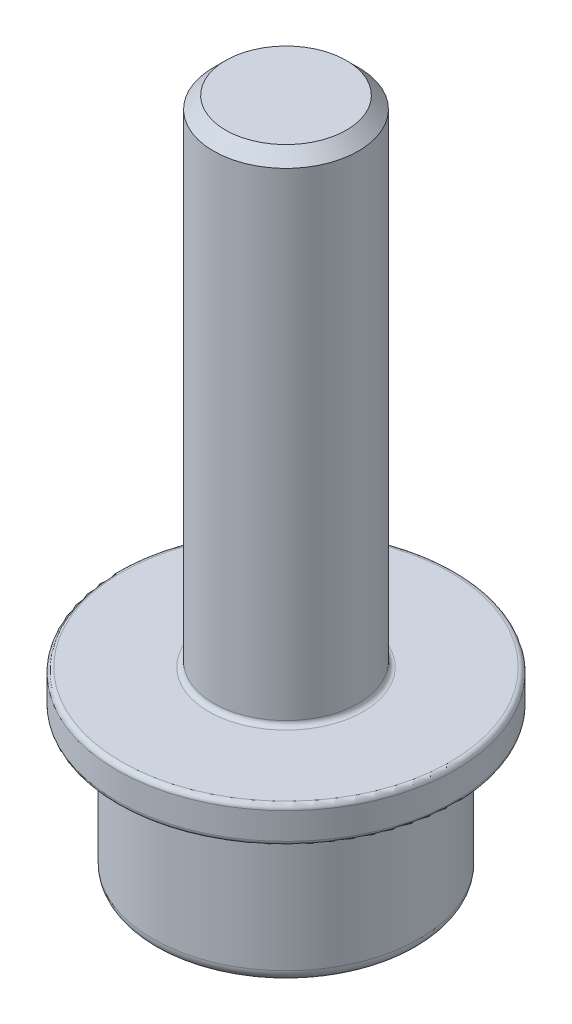
ISO-10303-21;
HEADER;
FILE_DESCRIPTION(('STEP AP214'),'2;1');
FILE_NAME('part.step','',(''),(''),'','','');
FILE_SCHEMA(('AUTOMOTIVE_DESIGN { 1 0 10303 214 1 1 1 1 }'));
ENDSEC;
DATA;
#1=APPLICATION_CONTEXT('core data for automotive mechanical design processes');
#2=APPLICATION_PROTOCOL_DEFINITION('international standard','automotive_design',2000,#1);
#3=PRODUCT_CONTEXT('',#1,'mechanical');
#4=PRODUCT('Part','Part','',(#3));
#5=PRODUCT_RELATED_PRODUCT_CATEGORY('part','',(#4));
#6=PRODUCT_DEFINITION_FORMATION('','',#4);
#7=PRODUCT_DEFINITION_CONTEXT('part definition',#1,'design');
#8=PRODUCT_DEFINITION('design','',#6,#7);
#9=PRODUCT_DEFINITION_SHAPE('','',#8);
#10=(LENGTH_UNIT() NAMED_UNIT(*) SI_UNIT(.MILLI.,.METRE.));
#11=(NAMED_UNIT(*) PLANE_ANGLE_UNIT() SI_UNIT($,.RADIAN.));
#12=(NAMED_UNIT(*) SI_UNIT($,.STERADIAN.) SOLID_ANGLE_UNIT());
#13=UNCERTAINTY_MEASURE_WITH_UNIT(LENGTH_MEASURE(1.E-05),#10,'distance_accuracy_value','');
#14=(GEOMETRIC_REPRESENTATION_CONTEXT(3) GLOBAL_UNCERTAINTY_ASSIGNED_CONTEXT((#13)) GLOBAL_UNIT_ASSIGNED_CONTEXT((#10,
#11,#12)) REPRESENTATION_CONTEXT('',''));
#15=CARTESIAN_POINT('',(0.,0.,0.));
#16=DIRECTION('',(0.,0.,1.));
#17=DIRECTION('',(1.,0.,0.));
#18=AXIS2_PLACEMENT_3D('',#15,#16,#17);
#19=CARTESIAN_POINT('',(0.,3.,0.));
#20=DIRECTION('',(0.,-1.,0.));
#21=DIRECTION('',(0.,0.,-1.));
#22=AXIS2_PLACEMENT_3D('',#19,#20,#21);
#23=CYLINDRICAL_SURFACE('',#22,2.75);
#24=CARTESIAN_POINT('',(0.,2.9,0.));
#25=DIRECTION('',(0.,1.,0.));
#26=DIRECTION('',(0.,0.,1.));
#27=AXIS2_PLACEMENT_3D('',#24,#25,#26);
#28=CIRCLE('',#27,2.75);
#29=CARTESIAN_POINT('',(0.,2.9,2.75));
#30=VERTEX_POINT('',#29);
#31=EDGE_CURVE('E201',#30,#30,#28,.F.);
#32=ORIENTED_EDGE('',*,*,#31,.T.);
#33=EDGE_LOOP('',(#32));
#34=FACE_BOUND('',#33,.T.);
#35=CARTESIAN_POINT('',(0.,0.25,0.));
#36=DIRECTION('',(0.,1.,0.));
#37=DIRECTION('',(0.,0.,1.));
#38=AXIS2_PLACEMENT_3D('',#35,#36,#37);
#39=CIRCLE('',#38,2.75);
#40=CARTESIAN_POINT('',(0.,0.25,2.75));
#41=VERTEX_POINT('',#40);
#42=EDGE_CURVE('E174',#41,#41,#39,.T.);
#43=ORIENTED_EDGE('',*,*,#42,.T.);
#44=EDGE_LOOP('',(#43));
#45=FACE_BOUND('',#44,.T.);
#46=ADVANCED_FACE('F33',(#34,#45),#23,.T.);
#47=CARTESIAN_POINT('',(0.,0.,0.));
#48=DIRECTION('',(0.,1.,0.));
#49=DIRECTION('',(0.,0.,1.));
#50=AXIS2_PLACEMENT_3D('',#47,#48,#49);
#51=PLANE('',#50);
#52=CARTESIAN_POINT('',(0.,0.,0.));
#53=DIRECTION('',(0.,1.,0.));
#54=DIRECTION('',(0.,0.,1.));
#55=AXIS2_PLACEMENT_3D('',#52,#53,#54);
#56=CIRCLE('',#55,2.5);
#57=CARTESIAN_POINT('',(0.,0.,2.5));
#58=VERTEX_POINT('',#57);
#59=EDGE_CURVE('E189',#58,#58,#56,.F.);
#60=ORIENTED_EDGE('',*,*,#59,.T.);
#61=EDGE_LOOP('',(#60));
#62=FACE_BOUND('',#61,.T.);
#63=DIRECTION('',(-0.69197693122312,0.,-0.721919612321922));
#64=VECTOR('',#63,1.);
#65=CARTESIAN_POINT('',(1.02450088015783,0.,-0.982008194523007));
#66=LINE('',#65,#64);
#67=CARTESIAN_POINT('',(1.59146357561211,0.,-0.390512335578875));
#68=VERTEX_POINT('',#67);
#69=CARTESIAN_POINT('',(0.457538184703553,0.,-1.57350405346714));
#70=VERTEX_POINT('',#69);
#71=EDGE_CURVE('E153',#68,#70,#66,.T.);
#72=ORIENTED_EDGE('',*,*,#71,.T.);
#73=DIRECTION('',(-0.971189189372558,0.,0.238309795111058));
#74=VECTOR('',#73,1.);
#75=CARTESIAN_POINT('',(-0.3381936031025,0.,-1.3782478856777));
#76=LINE('',#75,#74);
#77=CARTESIAN_POINT('',(-1.13392539090855,0.,-1.18299171788826));
#78=VERTEX_POINT('',#77);
#79=EDGE_CURVE('E163',#70,#78,#76,.T.);
#80=ORIENTED_EDGE('',*,*,#79,.T.);
#81=DIRECTION('',(-0.279212258149438,0.,0.96022940743298));
#82=VECTOR('',#81,1.);
#83=CARTESIAN_POINT('',(-1.36269448326033,0.,-0.396239691154693));
#84=LINE('',#83,#82);
#85=CARTESIAN_POINT('',(-1.59146357561211,0.,0.390512335578876));
#86=VERTEX_POINT('',#85);
#87=EDGE_CURVE('E161',#78,#86,#84,.T.);
#88=ORIENTED_EDGE('',*,*,#87,.T.);
#89=DIRECTION('',(0.69197693122312,0.,0.721919612321922));
#90=VECTOR('',#89,1.);
#91=CARTESIAN_POINT('',(-1.02450088015783,0.,0.982008194523007));
#92=LINE('',#91,#90);
#93=CARTESIAN_POINT('',(-0.457538184703552,0.,1.57350405346714));
#94=VERTEX_POINT('',#93);
#95=EDGE_CURVE('E159',#86,#94,#92,.T.);
#96=ORIENTED_EDGE('',*,*,#95,.T.);
#97=DIRECTION('',(0.971189189372558,0.,-0.238309795111058));
#98=VECTOR('',#97,1.);
#99=CARTESIAN_POINT('',(0.3381936031025,0.,1.3782478856777));
#100=LINE('',#99,#98);
#101=CARTESIAN_POINT('',(1.13392539090855,0.,1.18299171788826));
#102=VERTEX_POINT('',#101);
#103=EDGE_CURVE('E157',#94,#102,#100,.T.);
#104=ORIENTED_EDGE('',*,*,#103,.T.);
#105=DIRECTION('',(0.279212258149438,0.,-0.96022940743298));
#106=VECTOR('',#105,1.);
#107=CARTESIAN_POINT('',(1.36269448326033,0.,0.396239691154694));
#108=LINE('',#107,#106);
#109=EDGE_CURVE('E155',#102,#68,#108,.T.);
#110=ORIENTED_EDGE('',*,*,#109,.T.);
#111=EDGE_LOOP('',(#72,#80,#88,#96,#104,#110));
#112=FACE_BOUND('',#111,.T.);
#113=ADVANCED_FACE('F243',(#62,#112),#51,.F.);
#114=CARTESIAN_POINT('',(1.31110540565295,1.5,-0.321718223399928));
#115=DIRECTION('',(0.96022940743298,0.,0.279212258149438));
#116=DIRECTION('',(0.279212258149438,0.,-0.96022940743298));
#117=AXIS2_PLACEMENT_3D('',#114,#115,#116);
#118=PLANE('',#117);
#119=DIRECTION('',(0.,-1.,0.));
#120=VECTOR('',#119,1.);
#121=CARTESIAN_POINT('',(1.31110540565295,1.5,-0.321718223399928));
#122=LINE('',#121,#120);
#123=CARTESIAN_POINT('',(1.31110540565295,1.5,-0.321718223399928));
#124=VERTEX_POINT('',#123);
#125=CARTESIAN_POINT('',(1.31110540565295,0.25,-0.321718223399928));
#126=VERTEX_POINT('',#125);
#127=EDGE_CURVE('E139',#124,#126,#122,.T.);
#128=ORIENTED_EDGE('',*,*,#127,.T.);
#129=DIRECTION('',(-0.279212258149438,0.,0.96022940743298));
#130=VECTOR('',#129,1.);
#131=CARTESIAN_POINT('',(1.31110540565295,0.25,-0.321718223399928));
#132=LINE('',#131,#130);
#133=CARTESIAN_POINT('',(0.934168857151212,0.25,0.974591476634595));
#134=VERTEX_POINT('',#133);
#135=EDGE_CURVE('E55',#126,#134,#132,.T.);
#136=ORIENTED_EDGE('',*,*,#135,.T.);
#137=DIRECTION('',(0.,-1.,0.));
#138=VECTOR('',#137,1.);
#139=CARTESIAN_POINT('',(0.934168857151212,1.5,0.974591476634595));
#140=LINE('',#139,#138);
#141=CARTESIAN_POINT('',(0.934168857151212,1.5,0.974591476634595));
#142=VERTEX_POINT('',#141);
#143=EDGE_CURVE('E103',#142,#134,#140,.T.);
#144=ORIENTED_EDGE('',*,*,#143,.F.);
#145=DIRECTION('',(-0.279212258149438,0.,0.96022940743298));
#146=VECTOR('',#145,1.);
#147=CARTESIAN_POINT('',(1.31110540565295,1.5,-0.321718223399928));
#148=LINE('',#147,#146);
#149=EDGE_CURVE('E107',#124,#142,#148,.T.);
#150=ORIENTED_EDGE('',*,*,#149,.F.);
#151=EDGE_LOOP('',(#128,#136,#144,#150));
#152=FACE_BOUND('',#151,.T.);
#153=ADVANCED_FACE('F105',(#152),#118,.F.);
#154=CARTESIAN_POINT('',(0.376936548501741,1.5,-1.29630970003452));
#155=DIRECTION('',(0.721919612321922,0.,-0.69197693122312));
#156=DIRECTION('',(-0.69197693122312,0.,-0.721919612321922));
#157=AXIS2_PLACEMENT_3D('',#154,#155,#156);
#158=PLANE('',#157);
#159=DIRECTION('',(0.,-1.,0.));
#160=VECTOR('',#159,1.);
#161=CARTESIAN_POINT('',(0.376936548501741,1.5,-1.29630970003452));
#162=LINE('',#161,#160);
#163=CARTESIAN_POINT('',(0.376936548501741,1.5,-1.29630970003452));
#164=VERTEX_POINT('',#163);
#165=CARTESIAN_POINT('',(0.376936548501741,0.25,-1.29630970003452));
#166=VERTEX_POINT('',#165);
#167=EDGE_CURVE('E142',#164,#166,#162,.T.);
#168=ORIENTED_EDGE('',*,*,#167,.T.);
#169=DIRECTION('',(0.69197693122312,0.,0.721919612321922));
#170=VECTOR('',#169,1.);
#171=CARTESIAN_POINT('',(0.376936548501741,0.25,-1.29630970003452));
#172=LINE('',#171,#170);
#173=EDGE_CURVE('E48',#166,#126,#172,.T.);
#174=ORIENTED_EDGE('',*,*,#173,.T.);
#175=ORIENTED_EDGE('',*,*,#127,.F.);
#176=DIRECTION('',(0.69197693122312,0.,0.721919612321922));
#177=VECTOR('',#176,1.);
#178=CARTESIAN_POINT('',(0.376936548501741,1.5,-1.29630970003452));
#179=LINE('',#178,#177);
#180=EDGE_CURVE('E112',#164,#124,#179,.T.);
#181=ORIENTED_EDGE('',*,*,#180,.F.);
#182=EDGE_LOOP('',(#168,#174,#175,#181));
#183=FACE_BOUND('',#182,.T.);
#184=ADVANCED_FACE('F310',(#183),#158,.F.);
#185=CARTESIAN_POINT('',(-0.934168857151211,1.5,-0.974591476634595));
#186=DIRECTION('',(-0.238309795111058,0.,-0.971189189372557));
#187=DIRECTION('',(-0.971189189372558,0.,0.238309795111058));
#188=AXIS2_PLACEMENT_3D('',#185,#186,#187);
#189=PLANE('',#188);
#190=DIRECTION('',(0.,-1.,0.));
#191=VECTOR('',#190,1.);
#192=CARTESIAN_POINT('',(-0.934168857151211,1.5,-0.974591476634595));
#193=LINE('',#192,#191);
#194=CARTESIAN_POINT('',(-0.934168857151211,1.5,-0.974591476634595));
#195=VERTEX_POINT('',#194);
#196=CARTESIAN_POINT('',(-0.934168857151211,0.25,-0.974591476634595));
#197=VERTEX_POINT('',#196);
#198=EDGE_CURVE('E144',#195,#197,#193,.T.);
#199=ORIENTED_EDGE('',*,*,#198,.T.);
#200=DIRECTION('',(0.971189189372558,0.,-0.238309795111058));
#201=VECTOR('',#200,1.);
#202=CARTESIAN_POINT('',(-0.934168857151211,0.25,-0.974591476634595));
#203=LINE('',#202,#201);
#204=EDGE_CURVE('E141',#197,#166,#203,.T.);
#205=ORIENTED_EDGE('',*,*,#204,.T.);
#206=ORIENTED_EDGE('',*,*,#167,.F.);
#207=DIRECTION('',(0.971189189372558,0.,-0.238309795111058));
#208=VECTOR('',#207,1.);
#209=CARTESIAN_POINT('',(-0.934168857151211,1.5,-0.974591476634595));
#210=LINE('',#209,#208);
#211=EDGE_CURVE('E136',#195,#164,#210,.T.);
#212=ORIENTED_EDGE('',*,*,#211,.F.);
#213=EDGE_LOOP('',(#199,#205,#206,#212));
#214=FACE_BOUND('',#213,.T.);
#215=ADVANCED_FACE('F320',(#214),#189,.F.);
#216=CARTESIAN_POINT('',(-1.31110540565295,1.5,0.321718223399928));
#217=DIRECTION('',(-0.96022940743298,0.,-0.279212258149438));
#218=DIRECTION('',(-0.279212258149438,0.,0.96022940743298));
#219=AXIS2_PLACEMENT_3D('',#216,#217,#218);
#220=PLANE('',#219);
#221=DIRECTION('',(0.,-1.,0.));
#222=VECTOR('',#221,1.);
#223=CARTESIAN_POINT('',(-1.31110540565295,1.5,0.321718223399928));
#224=LINE('',#223,#222);
#225=CARTESIAN_POINT('',(-1.31110540565295,1.5,0.321718223399928));
#226=VERTEX_POINT('',#225);
#227=CARTESIAN_POINT('',(-1.31110540565295,0.25,0.321718223399928));
#228=VERTEX_POINT('',#227);
#229=EDGE_CURVE('E147',#226,#228,#224,.T.);
#230=ORIENTED_EDGE('',*,*,#229,.T.);
#231=DIRECTION('',(0.279212258149438,0.,-0.96022940743298));
#232=VECTOR('',#231,1.);
#233=CARTESIAN_POINT('',(-1.31110540565295,0.25,0.321718223399928));
#234=LINE('',#233,#232);
#235=EDGE_CURVE('E166',#228,#197,#234,.T.);
#236=ORIENTED_EDGE('',*,*,#235,.T.);
#237=ORIENTED_EDGE('',*,*,#198,.F.);
#238=DIRECTION('',(0.279212258149438,0.,-0.96022940743298));
#239=VECTOR('',#238,1.);
#240=CARTESIAN_POINT('',(-1.31110540565295,1.5,0.321718223399928));
#241=LINE('',#240,#239);
#242=EDGE_CURVE('E133',#226,#195,#241,.T.);
#243=ORIENTED_EDGE('',*,*,#242,.F.);
#244=EDGE_LOOP('',(#230,#236,#237,#243));
#245=FACE_BOUND('',#244,.T.);
#246=ADVANCED_FACE('F316',(#245),#220,.F.);
#247=CARTESIAN_POINT('',(-0.376936548501741,1.5,1.29630970003452));
#248=DIRECTION('',(-0.721919612321922,0.,0.69197693122312));
#249=DIRECTION('',(0.69197693122312,0.,0.721919612321922));
#250=AXIS2_PLACEMENT_3D('',#247,#248,#249);
#251=PLANE('',#250);
#252=DIRECTION('',(0.,-1.,0.));
#253=VECTOR('',#252,1.);
#254=CARTESIAN_POINT('',(-0.376936548501741,1.5,1.29630970003452));
#255=LINE('',#254,#253);
#256=CARTESIAN_POINT('',(-0.376936548501741,1.5,1.29630970003452));
#257=VERTEX_POINT('',#256);
#258=CARTESIAN_POINT('',(-0.376936548501741,0.25,1.29630970003452));
#259=VERTEX_POINT('',#258);
#260=EDGE_CURVE('E111',#257,#259,#255,.T.);
#261=ORIENTED_EDGE('',*,*,#260,.T.);
#262=DIRECTION('',(-0.69197693122312,0.,-0.721919612321922));
#263=VECTOR('',#262,1.);
#264=CARTESIAN_POINT('',(-0.376936548501741,0.25,1.29630970003452));
#265=LINE('',#264,#263);
#266=EDGE_CURVE('E168',#259,#228,#265,.T.);
#267=ORIENTED_EDGE('',*,*,#266,.T.);
#268=ORIENTED_EDGE('',*,*,#229,.F.);
#269=DIRECTION('',(-0.69197693122312,0.,-0.721919612321922));
#270=VECTOR('',#269,1.);
#271=CARTESIAN_POINT('',(-0.376936548501741,1.5,1.29630970003452));
#272=LINE('',#271,#270);
#273=EDGE_CURVE('E121',#257,#226,#272,.T.);
#274=ORIENTED_EDGE('',*,*,#273,.F.);
#275=EDGE_LOOP('',(#261,#267,#268,#274));
#276=FACE_BOUND('',#275,.T.);
#277=ADVANCED_FACE('F313',(#276),#251,.F.);
#278=CARTESIAN_POINT('',(0.934168857151212,1.5,0.974591476634595));
#279=DIRECTION('',(0.238309795111058,0.,0.971189189372558));
#280=DIRECTION('',(0.971189189372558,0.,-0.238309795111058));
#281=AXIS2_PLACEMENT_3D('',#278,#279,#280);
#282=PLANE('',#281);
#283=ORIENTED_EDGE('',*,*,#143,.T.);
#284=DIRECTION('',(-0.971189189372558,0.,0.238309795111058));
#285=VECTOR('',#284,1.);
#286=CARTESIAN_POINT('',(0.934168857151212,0.25,0.974591476634595));
#287=LINE('',#286,#285);
#288=EDGE_CURVE('E170',#134,#259,#287,.T.);
#289=ORIENTED_EDGE('',*,*,#288,.T.);
#290=ORIENTED_EDGE('',*,*,#260,.F.);
#291=DIRECTION('',(-0.971189189372557,0.,0.238309795111058));
#292=VECTOR('',#291,1.);
#293=CARTESIAN_POINT('',(0.934168857151212,1.5,0.974591476634595));
#294=LINE('',#293,#292);
#295=EDGE_CURVE('E115',#142,#257,#294,.T.);
#296=ORIENTED_EDGE('',*,*,#295,.F.);
#297=EDGE_LOOP('',(#283,#289,#290,#296));
#298=FACE_BOUND('',#297,.T.);
#299=ADVANCED_FACE('F116',(#298),#282,.F.);
#300=CARTESIAN_POINT('',(0.,1.5,0.));
#301=DIRECTION('',(0.,-1.,0.));
#302=DIRECTION('',(0.,0.,-1.));
#303=AXIS2_PLACEMENT_3D('',#300,#301,#302);
#304=PLANE('',#303);
#305=ORIENTED_EDGE('',*,*,#149,.T.);
#306=ORIENTED_EDGE('',*,*,#295,.T.);
#307=ORIENTED_EDGE('',*,*,#273,.T.);
#308=ORIENTED_EDGE('',*,*,#242,.T.);
#309=ORIENTED_EDGE('',*,*,#211,.T.);
#310=ORIENTED_EDGE('',*,*,#180,.T.);
#311=EDGE_LOOP('',(#305,#306,#307,#308,#309,#310));
#312=FACE_BOUND('',#311,.T.);
#313=ADVANCED_FACE('F123',(#312),#304,.T.);
#314=CARTESIAN_POINT('',(0.934168857151212,0.25,0.974591476634595));
#315=DIRECTION('',(0.168510472146205,0.70710678118655,0.686734461620399));
#316=DIRECTION('',(-0.971189189372558,0.,0.238309795111058));
#317=AXIS2_PLACEMENT_3D('',#314,#315,#316);
#318=PLANE('',#317);
#319=DIRECTION('',(-0.52308539228858,0.654653670707974,-0.545719931652563));
#320=VECTOR('',#319,1.);
#321=CARTESIAN_POINT('',(0.934168857151212,0.25,0.974591476634595));
#322=LINE('',#321,#320);
#323=EDGE_CURVE('E129',#102,#134,#322,.T.);
#324=ORIENTED_EDGE('',*,*,#323,.F.);
#325=ORIENTED_EDGE('',*,*,#103,.F.);
#326=DIRECTION('',(0.211064628018338,0.654653670707974,-0.72586520389674));
#327=VECTOR('',#326,1.);
#328=CARTESIAN_POINT('',(-0.376936548501741,0.25,1.29630970003452));
#329=LINE('',#328,#327);
#330=EDGE_CURVE('E126',#259,#94,#329,.F.);
#331=ORIENTED_EDGE('',*,*,#330,.F.);
#332=ORIENTED_EDGE('',*,*,#288,.F.);
#333=EDGE_LOOP('',(#324,#325,#331,#332));
#334=FACE_BOUND('',#333,.T.);
#335=ADVANCED_FACE('F273',(#334),#318,.F.);
#336=CARTESIAN_POINT('',(-0.376936548501741,0.25,1.29630970003452));
#337=DIRECTION('',(-0.510474253344393,0.70710678118655,0.489301580492523));
#338=DIRECTION('',(-0.69197693122312,0.,-0.721919612321922));
#339=AXIS2_PLACEMENT_3D('',#336,#337,#338);
#340=PLANE('',#339);
#341=ORIENTED_EDGE('',*,*,#330,.T.);
#342=ORIENTED_EDGE('',*,*,#95,.F.);
#343=DIRECTION('',(0.734150020306917,0.654653670707974,-0.180145272244176));
#344=VECTOR('',#343,1.);
#345=CARTESIAN_POINT('',(-1.31110540565295,0.25,0.321718223399928));
#346=LINE('',#345,#344);
#347=EDGE_CURVE('E182',#228,#86,#346,.F.);
#348=ORIENTED_EDGE('',*,*,#347,.F.);
#349=ORIENTED_EDGE('',*,*,#266,.F.);
#350=EDGE_LOOP('',(#341,#342,#348,#349));
#351=FACE_BOUND('',#350,.T.);
#352=ADVANCED_FACE('F269',(#351),#340,.F.);
#353=CARTESIAN_POINT('',(1.31110540565295,0.25,-0.321718223399928));
#354=DIRECTION('',(0.678984725490597,0.707106781186551,0.197432881127876));
#355=DIRECTION('',(-0.279212258149438,0.,0.96022940743298));
#356=AXIS2_PLACEMENT_3D('',#353,#354,#355);
#357=PLANE('',#356);
#358=ORIENTED_EDGE('',*,*,#323,.T.);
#359=ORIENTED_EDGE('',*,*,#135,.F.);
#360=DIRECTION('',(-0.734150020306917,0.654653670707974,0.180145272244176));
#361=VECTOR('',#360,1.);
#362=CARTESIAN_POINT('',(1.31110540565295,0.25,-0.321718223399928));
#363=LINE('',#362,#361);
#364=EDGE_CURVE('E179',#68,#126,#363,.T.);
#365=ORIENTED_EDGE('',*,*,#364,.F.);
#366=ORIENTED_EDGE('',*,*,#109,.F.);
#367=EDGE_LOOP('',(#358,#359,#365,#366));
#368=FACE_BOUND('',#367,.T.);
#369=ADVANCED_FACE('F265',(#368),#357,.F.);
#370=CARTESIAN_POINT('',(-1.31110540565295,0.25,0.321718223399928));
#371=DIRECTION('',(-0.678984725490598,0.70710678118655,-0.197432881127876));
#372=DIRECTION('',(0.279212258149438,0.,-0.96022940743298));
#373=AXIS2_PLACEMENT_3D('',#370,#371,#372);
#374=PLANE('',#373);
#375=ORIENTED_EDGE('',*,*,#347,.T.);
#376=ORIENTED_EDGE('',*,*,#87,.F.);
#377=DIRECTION('',(0.523085392288579,0.654653670707974,0.545719931652563));
#378=VECTOR('',#377,1.);
#379=CARTESIAN_POINT('',(-0.934168857151211,0.25,-0.974591476634595));
#380=LINE('',#379,#378);
#381=EDGE_CURVE('E177',#197,#78,#380,.F.);
#382=ORIENTED_EDGE('',*,*,#381,.F.);
#383=ORIENTED_EDGE('',*,*,#235,.F.);
#384=EDGE_LOOP('',(#375,#376,#382,#383));
#385=FACE_BOUND('',#384,.T.);
#386=ADVANCED_FACE('F261',(#385),#374,.F.);
#387=CARTESIAN_POINT('',(0.376936548501741,0.25,-1.29630970003452));
#388=DIRECTION('',(0.510474253344392,0.70710678118655,-0.489301580492523));
#389=DIRECTION('',(0.69197693122312,0.,0.721919612321922));
#390=AXIS2_PLACEMENT_3D('',#387,#388,#389);
#391=PLANE('',#390);
#392=ORIENTED_EDGE('',*,*,#364,.T.);
#393=ORIENTED_EDGE('',*,*,#173,.F.);
#394=DIRECTION('',(0.211064628018338,-0.654653670707974,-0.72586520389674));
#395=VECTOR('',#394,1.);
#396=CARTESIAN_POINT('',(0.269240391786957,0.584038370031141,-0.925935500024657));
#397=LINE('',#396,#395);
#398=EDGE_CURVE('E175',#70,#166,#397,.F.);
#399=ORIENTED_EDGE('',*,*,#398,.F.);
#400=ORIENTED_EDGE('',*,*,#71,.F.);
#401=EDGE_LOOP('',(#392,#393,#399,#400));
#402=FACE_BOUND('',#401,.T.);
#403=ADVANCED_FACE('F257',(#402),#391,.F.);
#404=CARTESIAN_POINT('',(-0.934168857151211,0.25,-0.974591476634595));
#405=DIRECTION('',(-0.168510472146205,0.70710678118655,-0.686734461620399));
#406=DIRECTION('',(0.971189189372558,0.,-0.238309795111058));
#407=AXIS2_PLACEMENT_3D('',#404,#405,#406);
#408=PLANE('',#407);
#409=ORIENTED_EDGE('',*,*,#381,.T.);
#410=ORIENTED_EDGE('',*,*,#79,.F.);
#411=ORIENTED_EDGE('',*,*,#398,.T.);
#412=ORIENTED_EDGE('',*,*,#204,.F.);
#413=EDGE_LOOP('',(#409,#410,#411,#412));
#414=FACE_BOUND('',#413,.T.);
#415=ADVANCED_FACE('F254',(#414),#408,.F.);
#416=CARTESIAN_POINT('',(0.,0.25,0.));
#417=DIRECTION('',(0.,1.,0.));
#418=DIRECTION('',(0.,0.,1.));
#419=AXIS2_PLACEMENT_3D('',#416,#417,#418);
#420=TOROIDAL_SURFACE('',#419,2.5,0.25);
#421=ORIENTED_EDGE('',*,*,#59,.F.);
#422=EDGE_LOOP('',(#421));
#423=FACE_BOUND('',#422,.T.);
#424=ORIENTED_EDGE('',*,*,#42,.F.);
#425=EDGE_LOOP('',(#424));
#426=FACE_BOUND('',#425,.T.);
#427=ADVANCED_FACE('F239',(#423,#426),#420,.T.);
#428=CARTESIAN_POINT('',(0.,2.9,0.));
#429=DIRECTION('',(0.,1.,0.));
#430=DIRECTION('',(0.,0.,1.));
#431=AXIS2_PLACEMENT_3D('',#428,#429,#430);
#432=TOROIDAL_SURFACE('',#431,2.65,0.1);
#433=ORIENTED_EDGE('',*,*,#31,.F.);
#434=EDGE_LOOP('',(#433));
#435=FACE_BOUND('',#434,.T.);
#436=CARTESIAN_POINT('',(0.,3.,0.));
#437=DIRECTION('',(0.,1.,0.));
#438=DIRECTION('',(0.,0.,1.));
#439=AXIS2_PLACEMENT_3D('',#436,#437,#438);
#440=CIRCLE('',#439,2.65);
#441=CARTESIAN_POINT('',(0.,3.,2.65));
#442=VERTEX_POINT('',#441);
#443=EDGE_CURVE('E198',#442,#442,#440,.T.);
#444=ORIENTED_EDGE('',*,*,#443,.F.);
#445=EDGE_LOOP('',(#444));
#446=FACE_BOUND('',#445,.T.);
#447=ADVANCED_FACE('F230',(#435,#446),#432,.T.);
#448=CARTESIAN_POINT('',(0.,3.75,0.));
#449=DIRECTION('',(0.,1.,0.));
#450=DIRECTION('',(0.,0.,1.));
#451=AXIS2_PLACEMENT_3D('',#448,#449,#450);
#452=PLANE('',#451);
#453=CARTESIAN_POINT('',(0.,3.75,0.));
#454=DIRECTION('',(0.,1.,0.));
#455=DIRECTION('',(0.,0.,1.));
#456=AXIS2_PLACEMENT_3D('',#453,#454,#455);
#457=CIRCLE('',#456,1.6);
#458=CARTESIAN_POINT('',(0.,3.75,1.6));
#459=VERTEX_POINT('',#458);
#460=EDGE_CURVE('E210',#459,#459,#457,.F.);
#461=ORIENTED_EDGE('',*,*,#460,.T.);
#462=EDGE_LOOP('',(#461));
#463=FACE_BOUND('',#462,.T.);
#464=CARTESIAN_POINT('',(0.,3.75,0.));
#465=DIRECTION('',(0.,1.,0.));
#466=DIRECTION('',(0.,0.,1.));
#467=AXIS2_PLACEMENT_3D('',#464,#465,#466);
#468=CIRCLE('',#467,3.4);
#469=CARTESIAN_POINT('',(0.,3.75,3.4));
#470=VERTEX_POINT('',#469);
#471=EDGE_CURVE('E207',#470,#470,#468,.T.);
#472=ORIENTED_EDGE('',*,*,#471,.T.);
#473=EDGE_LOOP('',(#472));
#474=FACE_BOUND('',#473,.T.);
#475=ADVANCED_FACE('F227',(#463,#474),#452,.T.);
#476=CARTESIAN_POINT('',(0.,3.,0.));
#477=DIRECTION('',(0.,1.,0.));
#478=DIRECTION('',(0.,0.,1.));
#479=AXIS2_PLACEMENT_3D('',#476,#477,#478);
#480=PLANE('',#479);
#481=CARTESIAN_POINT('',(0.,3.,0.));
#482=DIRECTION('',(0.,1.,0.));
#483=DIRECTION('',(0.,0.,1.));
#484=AXIS2_PLACEMENT_3D('',#481,#482,#483);
#485=CIRCLE('',#484,3.4);
#486=CARTESIAN_POINT('',(0.,3.,3.4));
#487=VERTEX_POINT('',#486);
#488=EDGE_CURVE('E11',#487,#487,#485,.F.);
#489=ORIENTED_EDGE('',*,*,#488,.T.);
#490=EDGE_LOOP('',(#489));
#491=FACE_BOUND('',#490,.T.);
#492=ORIENTED_EDGE('',*,*,#443,.T.);
#493=EDGE_LOOP('',(#492));
#494=FACE_BOUND('',#493,.T.);
#495=ADVANCED_FACE('F229',(#491,#494),#480,.F.);
#496=CARTESIAN_POINT('',(0.,3.75,0.));
#497=DIRECTION('',(0.,-1.,0.));
#498=DIRECTION('',(0.,0.,-1.));
#499=AXIS2_PLACEMENT_3D('',#496,#497,#498);
#500=CYLINDRICAL_SURFACE('',#499,3.5);
#501=CARTESIAN_POINT('',(0.,3.65,0.));
#502=DIRECTION('',(0.,1.,0.));
#503=DIRECTION('',(0.,0.,1.));
#504=AXIS2_PLACEMENT_3D('',#501,#502,#503);
#505=CIRCLE('',#504,3.5);
#506=CARTESIAN_POINT('',(0.,3.65,3.5));
#507=VERTEX_POINT('',#506);
#508=EDGE_CURVE('E41',#507,#507,#505,.F.);
#509=ORIENTED_EDGE('',*,*,#508,.T.);
#510=EDGE_LOOP('',(#509));
#511=FACE_BOUND('',#510,.T.);
#512=CARTESIAN_POINT('',(0.,3.1,0.));
#513=DIRECTION('',(0.,1.,0.));
#514=DIRECTION('',(0.,0.,1.));
#515=AXIS2_PLACEMENT_3D('',#512,#513,#514);
#516=CIRCLE('',#515,3.5);
#517=CARTESIAN_POINT('',(0.,3.1,3.5));
#518=VERTEX_POINT('',#517);
#519=EDGE_CURVE('E213',#518,#518,#516,.T.);
#520=ORIENTED_EDGE('',*,*,#519,.T.);
#521=EDGE_LOOP('',(#520));
#522=FACE_BOUND('',#521,.T.);
#523=ADVANCED_FACE('F218',(#511,#522),#500,.T.);
#524=CARTESIAN_POINT('',(0.,14.,0.));
#525=DIRECTION('',(0.,1.,0.));
#526=DIRECTION('',(0.,0.,1.));
#527=AXIS2_PLACEMENT_3D('',#524,#525,#526);
#528=PLANE('',#527);
#529=CARTESIAN_POINT('',(0.,14.,0.));
#530=DIRECTION('',(0.,1.,0.));
#531=DIRECTION('',(0.,0.,1.));
#532=AXIS2_PLACEMENT_3D('',#529,#530,#531);
#533=CIRCLE('',#532,1.25);
#534=CARTESIAN_POINT('',(0.,14.,1.25));
#535=VERTEX_POINT('',#534);
#536=EDGE_CURVE('E192',#535,#535,#533,.T.);
#537=ORIENTED_EDGE('',*,*,#536,.T.);
#538=EDGE_LOOP('',(#537));
#539=FACE_BOUND('',#538,.T.);
#540=ADVANCED_FACE('F284',(#539),#528,.T.);
#541=CARTESIAN_POINT('',(0.,14.,0.));
#542=DIRECTION('',(0.,-1.,0.));
#543=DIRECTION('',(0.,0.,-1.));
#544=AXIS2_PLACEMENT_3D('',#541,#542,#543);
#545=CONICAL_SURFACE('',#544,1.25,0.78539816339745);
#546=CARTESIAN_POINT('',(0.,13.75,0.));
#547=DIRECTION('',(0.,1.,0.));
#548=DIRECTION('',(0.,0.,1.));
#549=AXIS2_PLACEMENT_3D('',#546,#547,#548);
#550=CIRCLE('',#549,1.5);
#551=CARTESIAN_POINT('',(0.,13.75,1.5));
#552=VERTEX_POINT('',#551);
#553=EDGE_CURVE('E195',#552,#552,#550,.F.);
#554=ORIENTED_EDGE('',*,*,#553,.F.);
#555=EDGE_LOOP('',(#554));
#556=FACE_BOUND('',#555,.T.);
#557=ORIENTED_EDGE('',*,*,#536,.F.);
#558=EDGE_LOOP('',(#557));
#559=FACE_BOUND('',#558,.T.);
#560=ADVANCED_FACE('F281',(#556,#559),#545,.T.);
#561=CARTESIAN_POINT('',(0.,14.,0.));
#562=DIRECTION('',(0.,-1.,0.));
#563=DIRECTION('',(0.,0.,-1.));
#564=AXIS2_PLACEMENT_3D('',#561,#562,#563);
#565=CYLINDRICAL_SURFACE('',#564,1.5);
#566=CARTESIAN_POINT('',(0.,3.85,0.));
#567=DIRECTION('',(0.,1.,0.));
#568=DIRECTION('',(0.,0.,1.));
#569=AXIS2_PLACEMENT_3D('',#566,#567,#568);
#570=CIRCLE('',#569,1.5);
#571=CARTESIAN_POINT('',(0.,3.85,1.5));
#572=VERTEX_POINT('',#571);
#573=EDGE_CURVE('E204',#572,#572,#570,.T.);
#574=ORIENTED_EDGE('',*,*,#573,.T.);
#575=EDGE_LOOP('',(#574));
#576=FACE_BOUND('',#575,.T.);
#577=ORIENTED_EDGE('',*,*,#553,.T.);
#578=EDGE_LOOP('',(#577));
#579=FACE_BOUND('',#578,.T.);
#580=ADVANCED_FACE('F283',(#576,#579),#565,.T.);
#581=CARTESIAN_POINT('',(0.,3.85,0.));
#582=DIRECTION('',(0.,1.,0.));
#583=DIRECTION('',(0.,0.,1.));
#584=AXIS2_PLACEMENT_3D('',#581,#582,#583);
#585=TOROIDAL_SURFACE('',#584,1.6,0.1);
#586=ORIENTED_EDGE('',*,*,#460,.F.);
#587=EDGE_LOOP('',(#586));
#588=FACE_BOUND('',#587,.T.);
#589=ORIENTED_EDGE('',*,*,#573,.F.);
#590=EDGE_LOOP('',(#589));
#591=FACE_BOUND('',#590,.T.);
#592=ADVANCED_FACE('F224',(#588,#591),#585,.F.);
#593=CARTESIAN_POINT('',(0.,3.65,0.));
#594=DIRECTION('',(0.,1.,0.));
#595=DIRECTION('',(0.,0.,1.));
#596=AXIS2_PLACEMENT_3D('',#593,#594,#595);
#597=TOROIDAL_SURFACE('',#596,3.4,0.1);
#598=ORIENTED_EDGE('',*,*,#508,.F.);
#599=EDGE_LOOP('',(#598));
#600=FACE_BOUND('',#599,.T.);
#601=ORIENTED_EDGE('',*,*,#471,.F.);
#602=EDGE_LOOP('',(#601));
#603=FACE_BOUND('',#602,.T.);
#604=ADVANCED_FACE('F221',(#600,#603),#597,.T.);
#605=CARTESIAN_POINT('',(0.,3.1,0.));
#606=DIRECTION('',(0.,1.,0.));
#607=DIRECTION('',(0.,0.,1.));
#608=AXIS2_PLACEMENT_3D('',#605,#606,#607);
#609=TOROIDAL_SURFACE('',#608,3.4,0.1);
#610=ORIENTED_EDGE('',*,*,#488,.F.);
#611=EDGE_LOOP('',(#610));
#612=FACE_BOUND('',#611,.T.);
#613=ORIENTED_EDGE('',*,*,#519,.F.);
#614=EDGE_LOOP('',(#613));
#615=FACE_BOUND('',#614,.T.);
#616=ADVANCED_FACE('F35',(#612,#615),#609,.T.);
#617=CLOSED_SHELL('',(#46,#113,#153,#184,#215,#246,#277,#299,#313,#335,#352,#369,#386,#403,#415,
#427,#447,#475,#495,#523,#540,#560,#580,#592,#604,#616));
#618=MANIFOLD_SOLID_BREP('B2',#617);
#619=ADVANCED_BREP_SHAPE_REPRESENTATION('',(#18,#618),#14);
#620=SHAPE_DEFINITION_REPRESENTATION(#9,#619);
ENDSEC;
END-ISO-10303-21;
